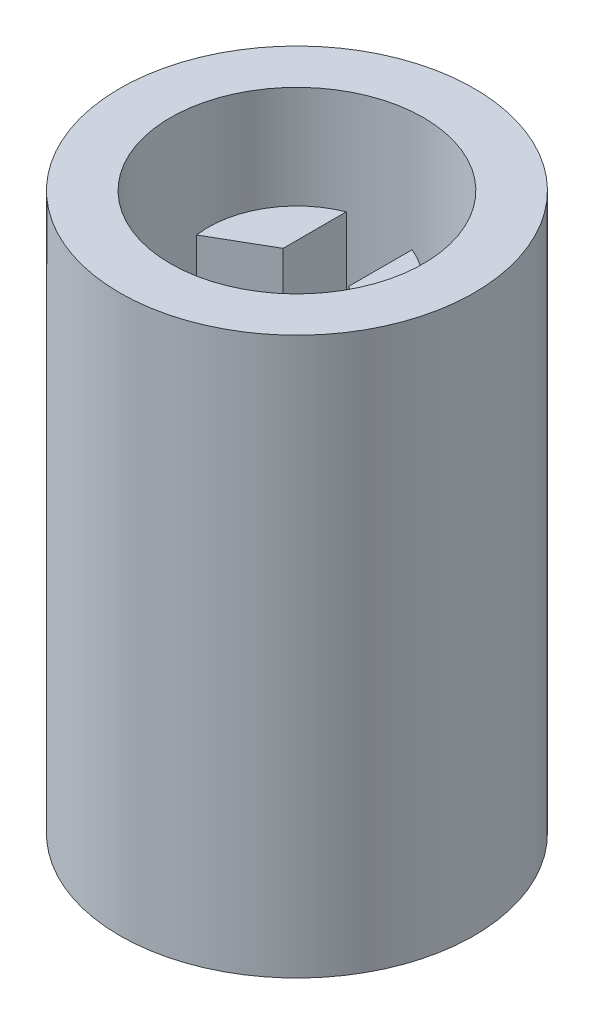
ISO-10303-21;
HEADER;
FILE_DESCRIPTION(('STEP AP214'),'2;1');
FILE_NAME('part.step','',(''),(''),'','','');
FILE_SCHEMA(('AUTOMOTIVE_DESIGN { 1 0 10303 214 1 1 1 1 }'));
ENDSEC;
DATA;
#1=APPLICATION_CONTEXT('core data for automotive mechanical design processes');
#2=APPLICATION_PROTOCOL_DEFINITION('international standard','automotive_design',2000,#1);
#3=PRODUCT_CONTEXT('',#1,'mechanical');
#4=PRODUCT('Part','Part','',(#3));
#5=PRODUCT_RELATED_PRODUCT_CATEGORY('part','',(#4));
#6=PRODUCT_DEFINITION_FORMATION('','',#4);
#7=PRODUCT_DEFINITION_CONTEXT('part definition',#1,'design');
#8=PRODUCT_DEFINITION('design','',#6,#7);
#9=PRODUCT_DEFINITION_SHAPE('','',#8);
#10=(LENGTH_UNIT() NAMED_UNIT(*) SI_UNIT(.MILLI.,.METRE.));
#11=(NAMED_UNIT(*) PLANE_ANGLE_UNIT() SI_UNIT($,.RADIAN.));
#12=(NAMED_UNIT(*) SI_UNIT($,.STERADIAN.) SOLID_ANGLE_UNIT());
#13=UNCERTAINTY_MEASURE_WITH_UNIT(LENGTH_MEASURE(1.E-05),#10,'distance_accuracy_value','');
#14=(GEOMETRIC_REPRESENTATION_CONTEXT(3) GLOBAL_UNCERTAINTY_ASSIGNED_CONTEXT((#13)) GLOBAL_UNIT_ASSIGNED_CONTEXT((#10,
#11,#12)) REPRESENTATION_CONTEXT('',''));
#15=CARTESIAN_POINT('',(0.,0.,0.));
#16=DIRECTION('',(0.,0.,1.));
#17=DIRECTION('',(1.,0.,0.));
#18=AXIS2_PLACEMENT_3D('',#15,#16,#17);
#19=CARTESIAN_POINT('',(0.,22.,0.));
#20=DIRECTION('',(0.,-1.,0.));
#21=DIRECTION('',(0.,0.,-1.));
#22=AXIS2_PLACEMENT_3D('',#19,#20,#21);
#23=CYLINDRICAL_SURFACE('',#22,7.);
#24=CARTESIAN_POINT('',(0.,22.,0.));
#25=DIRECTION('',(0.,1.,0.));
#26=DIRECTION('',(0.,0.,1.));
#27=AXIS2_PLACEMENT_3D('',#24,#25,#26);
#28=CIRCLE('',#27,7.);
#29=CARTESIAN_POINT('',(0.,22.,7.));
#30=VERTEX_POINT('',#29);
#31=EDGE_CURVE('E11',#30,#30,#28,.T.);
#32=ORIENTED_EDGE('',*,*,#31,.F.);
#33=EDGE_LOOP('',(#32));
#34=FACE_BOUND('',#33,.T.);
#35=CARTESIAN_POINT('',(0.,0.,0.));
#36=DIRECTION('',(0.,1.,0.));
#37=DIRECTION('',(0.,0.,1.));
#38=AXIS2_PLACEMENT_3D('',#35,#36,#37);
#39=CIRCLE('',#38,7.);
#40=CARTESIAN_POINT('',(0.,0.,7.));
#41=VERTEX_POINT('',#40);
#42=EDGE_CURVE('E49',#41,#41,#39,.T.);
#43=ORIENTED_EDGE('',*,*,#42,.T.);
#44=EDGE_LOOP('',(#43));
#45=FACE_BOUND('',#44,.T.);
#46=ADVANCED_FACE('F46',(#34,#45),#23,.T.);
#47=CARTESIAN_POINT('',(0.,22.,0.));
#48=DIRECTION('',(0.,1.,0.));
#49=DIRECTION('',(0.,0.,1.));
#50=AXIS2_PLACEMENT_3D('',#47,#48,#49);
#51=PLANE('',#50);
#52=CARTESIAN_POINT('',(0.,22.,0.));
#53=DIRECTION('',(0.,1.,0.));
#54=DIRECTION('',(0.,0.,1.));
#55=AXIS2_PLACEMENT_3D('',#52,#53,#54);
#56=CIRCLE('',#55,5.);
#57=CARTESIAN_POINT('',(0.,22.,5.));
#58=VERTEX_POINT('',#57);
#59=EDGE_CURVE('E500',#58,#58,#56,.T.);
#60=ORIENTED_EDGE('',*,*,#59,.F.);
#61=EDGE_LOOP('',(#60));
#62=FACE_BOUND('',#61,.T.);
#63=ORIENTED_EDGE('',*,*,#31,.T.);
#64=EDGE_LOOP('',(#63));
#65=FACE_BOUND('',#64,.T.);
#66=ADVANCED_FACE('F244',(#62,#65),#51,.T.);
#67=CARTESIAN_POINT('',(0.,0.,0.));
#68=DIRECTION('',(0.,1.,0.));
#69=DIRECTION('',(0.,0.,1.));
#70=AXIS2_PLACEMENT_3D('',#67,#68,#69);
#71=PLANE('',#70);
#72=CARTESIAN_POINT('',(0.,0.,0.));
#73=DIRECTION('',(0.,1.,0.));
#74=DIRECTION('',(0.,0.,1.));
#75=AXIS2_PLACEMENT_3D('',#72,#73,#74);
#76=CIRCLE('',#75,0.5);
#77=CARTESIAN_POINT('',(0.,0.,0.5));
#78=VERTEX_POINT('',#77);
#79=EDGE_CURVE('E517',#78,#78,#76,.T.);
#80=ORIENTED_EDGE('',*,*,#79,.T.);
#81=EDGE_LOOP('',(#80));
#82=FACE_BOUND('',#81,.T.);
#83=ORIENTED_EDGE('',*,*,#42,.F.);
#84=EDGE_LOOP('',(#83));
#85=FACE_BOUND('',#84,.T.);
#86=ADVANCED_FACE('F241',(#82,#85),#71,.F.);
#87=CARTESIAN_POINT('',(0.,19.,0.));
#88=DIRECTION('',(0.,-1.,0.));
#89=DIRECTION('',(0.,0.,-1.));
#90=AXIS2_PLACEMENT_3D('',#87,#88,#89);
#91=CYLINDRICAL_SURFACE('',#90,5.);
#92=CARTESIAN_POINT('',(0.,2.,0.));
#93=DIRECTION('',(0.,-1.,0.));
#94=DIRECTION('',(0.,0.,-1.));
#95=AXIS2_PLACEMENT_3D('',#92,#93,#94);
#96=CIRCLE('',#95,5.);
#97=CARTESIAN_POINT('',(0.,2.,-5.));
#98=VERTEX_POINT('',#97);
#99=EDGE_CURVE('E175',#98,#98,#96,.T.);
#100=ORIENTED_EDGE('',*,*,#99,.T.);
#101=EDGE_LOOP('',(#100));
#102=FACE_BOUND('',#101,.T.);
#103=ORIENTED_EDGE('',*,*,#59,.T.);
#104=EDGE_LOOP('',(#103));
#105=FACE_BOUND('',#104,.T.);
#106=ADVANCED_FACE('F243',(#102,#105),#91,.F.);
#107=CARTESIAN_POINT('',(1.29903810567666,19.,-0.750000000000004));
#108=DIRECTION('',(1.,0.,0.));
#109=DIRECTION('',(0.,0.,-1.));
#110=AXIS2_PLACEMENT_3D('',#107,#108,#109);
#111=PLANE('',#110);
#112=DIRECTION('',(0.,0.,1.));
#113=VECTOR('',#112,1.);
#114=CARTESIAN_POINT('',(1.29903810567666,4.,-0.750000000000004));
#115=LINE('',#114,#113);
#116=CARTESIAN_POINT('',(1.29903810567664,4.,-3.25000000000001));
#117=VERTEX_POINT('',#116);
#118=CARTESIAN_POINT('',(1.29903810567666,4.,-0.750000000000004));
#119=VERTEX_POINT('',#118);
#120=EDGE_CURVE('E210',#117,#119,#115,.T.);
#121=ORIENTED_EDGE('',*,*,#120,.T.);
#122=DIRECTION('',(0.,-1.,0.));
#123=VECTOR('',#122,1.);
#124=CARTESIAN_POINT('',(1.29903810567666,19.,-0.750000000000004));
#125=LINE('',#124,#123);
#126=CARTESIAN_POINT('',(1.29903810567666,19.,-0.750000000000004));
#127=VERTEX_POINT('',#126);
#128=EDGE_CURVE('E233',#127,#119,#125,.T.);
#129=ORIENTED_EDGE('',*,*,#128,.F.);
#130=DIRECTION('',(0.,0.,1.));
#131=VECTOR('',#130,1.);
#132=CARTESIAN_POINT('',(1.29903810567666,19.,-0.750000000000004));
#133=LINE('',#132,#131);
#134=CARTESIAN_POINT('',(1.29903810567664,19.,-3.25000000000001));
#135=VERTEX_POINT('',#134);
#136=EDGE_CURVE('E62',#135,#127,#133,.T.);
#137=ORIENTED_EDGE('',*,*,#136,.F.);
#138=DIRECTION('',(0.,-1.,0.));
#139=VECTOR('',#138,1.);
#140=CARTESIAN_POINT('',(1.29903810567664,19.,-3.25000000000001));
#141=LINE('',#140,#139);
#142=EDGE_CURVE('E125',#135,#117,#141,.T.);
#143=ORIENTED_EDGE('',*,*,#142,.T.);
#144=EDGE_LOOP('',(#121,#129,#137,#143));
#145=FACE_BOUND('',#144,.T.);
#146=ADVANCED_FACE('F251',(#145),#111,.F.);
#147=CARTESIAN_POINT('',(1.29903810567666,19.,-0.750000000000004));
#148=DIRECTION('',(0.5,0.,-0.866025403784439));
#149=DIRECTION('',(-0.866025403784439,0.,-0.5));
#150=AXIS2_PLACEMENT_3D('',#147,#148,#149);
#151=PLANE('',#150);
#152=DIRECTION('',(0.866025403784439,0.,0.5));
#153=VECTOR('',#152,1.);
#154=CARTESIAN_POINT('',(1.29903810567666,4.,-0.750000000000004));
#155=LINE('',#154,#153);
#156=CARTESIAN_POINT('',(3.46410161513776,4.,0.499999999999997));
#157=VERTEX_POINT('',#156);
#158=EDGE_CURVE('E75',#119,#157,#155,.T.);
#159=ORIENTED_EDGE('',*,*,#158,.T.);
#160=DIRECTION('',(0.,-1.,0.));
#161=VECTOR('',#160,1.);
#162=CARTESIAN_POINT('',(3.46410161513776,19.,0.499999999999997));
#163=LINE('',#162,#161);
#164=CARTESIAN_POINT('',(3.46410161513776,19.,0.499999999999997));
#165=VERTEX_POINT('',#164);
#166=EDGE_CURVE('E230',#165,#157,#163,.T.);
#167=ORIENTED_EDGE('',*,*,#166,.F.);
#168=DIRECTION('',(0.866025403784439,0.,0.5));
#169=VECTOR('',#168,1.);
#170=CARTESIAN_POINT('',(1.29903810567666,19.,-0.750000000000004));
#171=LINE('',#170,#169);
#172=EDGE_CURVE('E213',#127,#165,#171,.T.);
#173=ORIENTED_EDGE('',*,*,#172,.F.);
#174=ORIENTED_EDGE('',*,*,#128,.T.);
#175=EDGE_LOOP('',(#159,#167,#173,#174));
#176=FACE_BOUND('',#175,.T.);
#177=ADVANCED_FACE('F281',(#176),#151,.F.);
#178=CARTESIAN_POINT('',(0.,19.,0.));
#179=DIRECTION('',(0.,-1.,0.));
#180=DIRECTION('',(0.,0.,-1.));
#181=AXIS2_PLACEMENT_3D('',#178,#179,#180);
#182=CYLINDRICAL_SURFACE('',#181,3.5);
#183=CARTESIAN_POINT('',(0.,4.,0.));
#184=DIRECTION('',(0.,1.,0.));
#185=DIRECTION('',(0.,0.,1.));
#186=AXIS2_PLACEMENT_3D('',#183,#184,#185);
#187=CIRCLE('',#186,3.5);
#188=EDGE_CURVE('E214',#157,#117,#187,.T.);
#189=ORIENTED_EDGE('',*,*,#188,.T.);
#190=ORIENTED_EDGE('',*,*,#142,.F.);
#191=CARTESIAN_POINT('',(0.,19.,0.));
#192=DIRECTION('',(0.,1.,0.));
#193=DIRECTION('',(0.,0.,1.));
#194=AXIS2_PLACEMENT_3D('',#191,#192,#193);
#195=CIRCLE('',#194,3.5);
#196=EDGE_CURVE('E218',#165,#135,#195,.T.);
#197=ORIENTED_EDGE('',*,*,#196,.F.);
#198=ORIENTED_EDGE('',*,*,#166,.T.);
#199=EDGE_LOOP('',(#189,#190,#197,#198));
#200=FACE_BOUND('',#199,.T.);
#201=ADVANCED_FACE('F289',(#200),#182,.T.);
#202=CARTESIAN_POINT('',(-1.29903810567666,19.,-0.749999999999997));
#203=DIRECTION('',(-0.500000000000005,0.,-0.866025403784436));
#204=DIRECTION('',(-0.866025403784436,0.,0.500000000000005));
#205=AXIS2_PLACEMENT_3D('',#202,#203,#204);
#206=PLANE('',#205);
#207=DIRECTION('',(0.866025403784436,0.,-0.500000000000005));
#208=VECTOR('',#207,1.);
#209=CARTESIAN_POINT('',(-1.29903810567666,4.,-0.749999999999997));
#210=LINE('',#209,#208);
#211=CARTESIAN_POINT('',(-3.46410161513775,4.,0.500000000000017));
#212=VERTEX_POINT('',#211);
#213=CARTESIAN_POINT('',(-1.29903810567666,4.,-0.749999999999997));
#214=VERTEX_POINT('',#213);
#215=EDGE_CURVE('E184',#212,#214,#210,.T.);
#216=ORIENTED_EDGE('',*,*,#215,.T.);
#217=DIRECTION('',(0.,-1.,0.));
#218=VECTOR('',#217,1.);
#219=CARTESIAN_POINT('',(-1.29903810567666,19.,-0.749999999999997));
#220=LINE('',#219,#218);
#221=CARTESIAN_POINT('',(-1.29903810567666,19.,-0.749999999999997));
#222=VERTEX_POINT('',#221);
#223=EDGE_CURVE('E207',#222,#214,#220,.T.);
#224=ORIENTED_EDGE('',*,*,#223,.F.);
#225=DIRECTION('',(0.866025403784436,0.,-0.500000000000005));
#226=VECTOR('',#225,1.);
#227=CARTESIAN_POINT('',(-1.29903810567666,19.,-0.749999999999997));
#228=LINE('',#227,#226);
#229=CARTESIAN_POINT('',(-3.46410161513775,19.,0.500000000000017));
#230=VERTEX_POINT('',#229);
#231=EDGE_CURVE('E83',#230,#222,#228,.T.);
#232=ORIENTED_EDGE('',*,*,#231,.F.);
#233=DIRECTION('',(0.,-1.,0.));
#234=VECTOR('',#233,1.);
#235=CARTESIAN_POINT('',(-3.46410161513775,19.,0.500000000000017));
#236=LINE('',#235,#234);
#237=EDGE_CURVE('E121',#230,#212,#236,.T.);
#238=ORIENTED_EDGE('',*,*,#237,.T.);
#239=EDGE_LOOP('',(#216,#224,#232,#238));
#240=FACE_BOUND('',#239,.T.);
#241=ADVANCED_FACE('F297',(#240),#206,.F.);
#242=CARTESIAN_POINT('',(-1.29903810567666,19.,-0.749999999999997));
#243=DIRECTION('',(-1.,0.,0.));
#244=DIRECTION('',(0.,0.,1.));
#245=AXIS2_PLACEMENT_3D('',#242,#243,#244);
#246=PLANE('',#245);
#247=DIRECTION('',(0.,0.,-1.));
#248=VECTOR('',#247,1.);
#249=CARTESIAN_POINT('',(-1.29903810567666,4.,-0.749999999999997));
#250=LINE('',#249,#248);
#251=CARTESIAN_POINT('',(-1.29903810567666,4.,-3.25));
#252=VERTEX_POINT('',#251);
#253=EDGE_CURVE('E96',#214,#252,#250,.T.);
#254=ORIENTED_EDGE('',*,*,#253,.T.);
#255=DIRECTION('',(0.,-1.,0.));
#256=VECTOR('',#255,1.);
#257=CARTESIAN_POINT('',(-1.29903810567666,19.,-3.25));
#258=LINE('',#257,#256);
#259=CARTESIAN_POINT('',(-1.29903810567666,19.,-3.25));
#260=VERTEX_POINT('',#259);
#261=EDGE_CURVE('E204',#260,#252,#258,.T.);
#262=ORIENTED_EDGE('',*,*,#261,.F.);
#263=DIRECTION('',(0.,0.,-1.));
#264=VECTOR('',#263,1.);
#265=CARTESIAN_POINT('',(-1.29903810567666,19.,-0.749999999999997));
#266=LINE('',#265,#264);
#267=EDGE_CURVE('E187',#222,#260,#266,.T.);
#268=ORIENTED_EDGE('',*,*,#267,.F.);
#269=ORIENTED_EDGE('',*,*,#223,.T.);
#270=EDGE_LOOP('',(#254,#262,#268,#269));
#271=FACE_BOUND('',#270,.T.);
#272=ADVANCED_FACE('F306',(#271),#246,.F.);
#273=CARTESIAN_POINT('',(0.,19.,0.));
#274=DIRECTION('',(0.,-1.,0.));
#275=DIRECTION('',(0.,0.,-1.));
#276=AXIS2_PLACEMENT_3D('',#273,#274,#275);
#277=CYLINDRICAL_SURFACE('',#276,3.5);
#278=CARTESIAN_POINT('',(0.,4.,0.));
#279=DIRECTION('',(0.,1.,0.));
#280=DIRECTION('',(0.,0.,1.));
#281=AXIS2_PLACEMENT_3D('',#278,#279,#280);
#282=CIRCLE('',#281,3.5);
#283=EDGE_CURVE('E188',#252,#212,#282,.T.);
#284=ORIENTED_EDGE('',*,*,#283,.T.);
#285=ORIENTED_EDGE('',*,*,#237,.F.);
#286=CARTESIAN_POINT('',(0.,19.,0.));
#287=DIRECTION('',(0.,1.,0.));
#288=DIRECTION('',(0.,0.,1.));
#289=AXIS2_PLACEMENT_3D('',#286,#287,#288);
#290=CIRCLE('',#289,3.5);
#291=EDGE_CURVE('E192',#260,#230,#290,.T.);
#292=ORIENTED_EDGE('',*,*,#291,.F.);
#293=ORIENTED_EDGE('',*,*,#261,.T.);
#294=EDGE_LOOP('',(#284,#285,#292,#293));
#295=FACE_BOUND('',#294,.T.);
#296=ADVANCED_FACE('F314',(#295),#277,.T.);
#297=CARTESIAN_POINT('',(0.,19.,1.5));
#298=DIRECTION('',(-0.499999999999995,0.,0.866025403784441));
#299=DIRECTION('',(0.866025403784441,0.,0.499999999999995));
#300=AXIS2_PLACEMENT_3D('',#297,#298,#299);
#301=PLANE('',#300);
#302=DIRECTION('',(-0.866025403784441,0.,-0.499999999999995));
#303=VECTOR('',#302,1.);
#304=CARTESIAN_POINT('',(0.,4.,1.5));
#305=LINE('',#304,#303);
#306=CARTESIAN_POINT('',(2.16506350946111,4.,2.74999999999999));
#307=VERTEX_POINT('',#306);
#308=CARTESIAN_POINT('',(0.,4.,1.5));
#309=VERTEX_POINT('',#308);
#310=EDGE_CURVE('E171',#307,#309,#305,.T.);
#311=ORIENTED_EDGE('',*,*,#310,.T.);
#312=DIRECTION('',(0.,-1.,0.));
#313=VECTOR('',#312,1.);
#314=CARTESIAN_POINT('',(0.,19.,1.5));
#315=LINE('',#314,#313);
#316=CARTESIAN_POINT('',(0.,19.,1.5));
#317=VERTEX_POINT('',#316);
#318=EDGE_CURVE('E161',#317,#309,#315,.T.);
#319=ORIENTED_EDGE('',*,*,#318,.F.);
#320=DIRECTION('',(-0.866025403784441,0.,-0.499999999999995));
#321=VECTOR('',#320,1.);
#322=CARTESIAN_POINT('',(0.,19.,1.5));
#323=LINE('',#322,#321);
#324=CARTESIAN_POINT('',(2.16506350946111,19.,2.74999999999999));
#325=VERTEX_POINT('',#324);
#326=EDGE_CURVE('E104',#325,#317,#323,.T.);
#327=ORIENTED_EDGE('',*,*,#326,.F.);
#328=DIRECTION('',(0.,-1.,0.));
#329=VECTOR('',#328,1.);
#330=CARTESIAN_POINT('',(2.16506350946111,19.,2.74999999999999));
#331=LINE('',#330,#329);
#332=EDGE_CURVE('E152',#325,#307,#331,.T.);
#333=ORIENTED_EDGE('',*,*,#332,.T.);
#334=EDGE_LOOP('',(#311,#319,#327,#333));
#335=FACE_BOUND('',#334,.T.);
#336=ADVANCED_FACE('F323',(#335),#301,.F.);
#337=CARTESIAN_POINT('',(0.,19.,1.5));
#338=DIRECTION('',(0.500000000000001,0.,0.866025403784438));
#339=DIRECTION('',(0.866025403784438,0.,-0.500000000000001));
#340=AXIS2_PLACEMENT_3D('',#337,#338,#339);
#341=PLANE('',#340);
#342=DIRECTION('',(-0.866025403784438,0.,0.500000000000001));
#343=VECTOR('',#342,1.);
#344=CARTESIAN_POINT('',(0.,4.,1.5));
#345=LINE('',#344,#343);
#346=CARTESIAN_POINT('',(-2.16506350946109,4.,2.75));
#347=VERTEX_POINT('',#346);
#348=EDGE_CURVE('E116',#309,#347,#345,.T.);
#349=ORIENTED_EDGE('',*,*,#348,.T.);
#350=DIRECTION('',(0.,-1.,0.));
#351=VECTOR('',#350,1.);
#352=CARTESIAN_POINT('',(-2.16506350946109,19.,2.75));
#353=LINE('',#352,#351);
#354=CARTESIAN_POINT('',(-2.16506350946109,19.,2.75));
#355=VERTEX_POINT('',#354);
#356=EDGE_CURVE('E151',#355,#347,#353,.T.);
#357=ORIENTED_EDGE('',*,*,#356,.F.);
#358=DIRECTION('',(-0.866025403784438,0.,0.500000000000001));
#359=VECTOR('',#358,1.);
#360=CARTESIAN_POINT('',(0.,19.,1.5));
#361=LINE('',#360,#359);
#362=EDGE_CURVE('E156',#317,#355,#361,.T.);
#363=ORIENTED_EDGE('',*,*,#362,.F.);
#364=ORIENTED_EDGE('',*,*,#318,.T.);
#365=EDGE_LOOP('',(#349,#357,#363,#364));
#366=FACE_BOUND('',#365,.T.);
#367=ADVANCED_FACE('F159',(#366),#341,.F.);
#368=CARTESIAN_POINT('',(0.,19.,0.));
#369=DIRECTION('',(0.,-1.,0.));
#370=DIRECTION('',(0.,0.,-1.));
#371=AXIS2_PLACEMENT_3D('',#368,#369,#370);
#372=CYLINDRICAL_SURFACE('',#371,3.5);
#373=CARTESIAN_POINT('',(0.,4.,0.));
#374=DIRECTION('',(0.,1.,0.));
#375=DIRECTION('',(0.,0.,1.));
#376=AXIS2_PLACEMENT_3D('',#373,#374,#375);
#377=CIRCLE('',#376,3.5);
#378=EDGE_CURVE('E167',#347,#307,#377,.T.);
#379=ORIENTED_EDGE('',*,*,#378,.T.);
#380=ORIENTED_EDGE('',*,*,#332,.F.);
#381=CARTESIAN_POINT('',(0.,19.,0.));
#382=DIRECTION('',(0.,1.,0.));
#383=DIRECTION('',(0.,0.,1.));
#384=AXIS2_PLACEMENT_3D('',#381,#382,#383);
#385=CIRCLE('',#384,3.5);
#386=EDGE_CURVE('E147',#355,#325,#385,.T.);
#387=ORIENTED_EDGE('',*,*,#386,.F.);
#388=ORIENTED_EDGE('',*,*,#356,.T.);
#389=EDGE_LOOP('',(#379,#380,#387,#388));
#390=FACE_BOUND('',#389,.T.);
#391=ADVANCED_FACE('F150',(#390),#372,.T.);
#392=CARTESIAN_POINT('',(0.,4.,0.));
#393=DIRECTION('',(0.,-1.,0.));
#394=DIRECTION('',(0.,0.,-1.));
#395=AXIS2_PLACEMENT_3D('',#392,#393,#394);
#396=PLANE('',#395);
#397=CARTESIAN_POINT('',(-2.16506350946109,4.,-1.25));
#398=DIRECTION('',(0.,-1.,0.));
#399=DIRECTION('',(0.,0.,-1.));
#400=AXIS2_PLACEMENT_3D('',#397,#398,#399);
#401=CIRCLE('',#400,0.75);
#402=CARTESIAN_POINT('',(-2.16506350946109,4.,-2.));
#403=VERTEX_POINT('',#402);
#404=EDGE_CURVE('E493',#403,#403,#401,.T.);
#405=ORIENTED_EDGE('',*,*,#404,.F.);
#406=EDGE_LOOP('',(#405));
#407=FACE_BOUND('',#406,.T.);
#408=ORIENTED_EDGE('',*,*,#283,.F.);
#409=ORIENTED_EDGE('',*,*,#253,.F.);
#410=ORIENTED_EDGE('',*,*,#215,.F.);
#411=EDGE_LOOP('',(#408,#409,#410));
#412=FACE_BOUND('',#411,.T.);
#413=ADVANCED_FACE('F346',(#407,#412),#396,.T.);
#414=CARTESIAN_POINT('',(2.1650635094611,4.,-1.25));
#415=DIRECTION('',(0.,-1.,0.));
#416=DIRECTION('',(0.,0.,-1.));
#417=AXIS2_PLACEMENT_3D('',#414,#415,#416);
#418=CIRCLE('',#417,0.75);
#419=CARTESIAN_POINT('',(2.1650635094611,4.,-2.));
#420=VERTEX_POINT('',#419);
#421=EDGE_CURVE('E492',#420,#420,#418,.T.);
#422=ORIENTED_EDGE('',*,*,#421,.F.);
#423=EDGE_LOOP('',(#422));
#424=FACE_BOUND('',#423,.T.);
#425=ORIENTED_EDGE('',*,*,#188,.F.);
#426=ORIENTED_EDGE('',*,*,#158,.F.);
#427=ORIENTED_EDGE('',*,*,#120,.F.);
#428=EDGE_LOOP('',(#425,#426,#427));
#429=FACE_BOUND('',#428,.T.);
#430=ADVANCED_FACE('F354',(#424,#429),#396,.T.);
#431=CARTESIAN_POINT('',(0.,4.,2.5));
#432=DIRECTION('',(0.,-1.,0.));
#433=DIRECTION('',(0.,0.,-1.));
#434=AXIS2_PLACEMENT_3D('',#431,#432,#433);
#435=CIRCLE('',#434,0.750000000000004);
#436=CARTESIAN_POINT('',(0.,4.,1.75));
#437=VERTEX_POINT('',#436);
#438=EDGE_CURVE('E506',#437,#437,#435,.T.);
#439=ORIENTED_EDGE('',*,*,#438,.F.);
#440=EDGE_LOOP('',(#439));
#441=FACE_BOUND('',#440,.T.);
#442=ORIENTED_EDGE('',*,*,#378,.F.);
#443=ORIENTED_EDGE('',*,*,#348,.F.);
#444=ORIENTED_EDGE('',*,*,#310,.F.);
#445=EDGE_LOOP('',(#442,#443,#444));
#446=FACE_BOUND('',#445,.T.);
#447=ADVANCED_FACE('F357',(#441,#446),#396,.T.);
#448=CARTESIAN_POINT('',(0.,2.,0.));
#449=DIRECTION('',(0.,-1.,0.));
#450=DIRECTION('',(0.,0.,-1.));
#451=AXIS2_PLACEMENT_3D('',#448,#449,#450);
#452=PLANE('',#451);
#453=CARTESIAN_POINT('',(0.,2.,0.));
#454=DIRECTION('',(0.,1.,0.));
#455=DIRECTION('',(0.,0.,1.));
#456=AXIS2_PLACEMENT_3D('',#453,#454,#455);
#457=CIRCLE('',#456,0.5);
#458=CARTESIAN_POINT('',(0.,2.,0.5));
#459=VERTEX_POINT('',#458);
#460=EDGE_CURVE('E476',#459,#459,#457,.T.);
#461=ORIENTED_EDGE('',*,*,#460,.F.);
#462=EDGE_LOOP('',(#461));
#463=FACE_BOUND('',#462,.T.);
#464=CARTESIAN_POINT('',(2.1650635094611,2.,-1.25));
#465=DIRECTION('',(0.,-1.,0.));
#466=DIRECTION('',(0.,0.,-1.));
#467=AXIS2_PLACEMENT_3D('',#464,#465,#466);
#468=CIRCLE('',#467,0.75);
#469=CARTESIAN_POINT('',(2.1650635094611,2.,-2.));
#470=VERTEX_POINT('',#469);
#471=EDGE_CURVE('E480',#470,#470,#468,.T.);
#472=ORIENTED_EDGE('',*,*,#471,.T.);
#473=EDGE_LOOP('',(#472));
#474=FACE_BOUND('',#473,.T.);
#475=ORIENTED_EDGE('',*,*,#99,.F.);
#476=EDGE_LOOP('',(#475));
#477=FACE_BOUND('',#476,.T.);
#478=CARTESIAN_POINT('',(0.,2.,2.5));
#479=DIRECTION('',(0.,-1.,0.));
#480=DIRECTION('',(0.,0.,-1.));
#481=AXIS2_PLACEMENT_3D('',#478,#479,#480);
#482=CIRCLE('',#481,0.750000000000004);
#483=CARTESIAN_POINT('',(0.,2.,1.75));
#484=VERTEX_POINT('',#483);
#485=EDGE_CURVE('E487',#484,#484,#482,.T.);
#486=ORIENTED_EDGE('',*,*,#485,.T.);
#487=EDGE_LOOP('',(#486));
#488=FACE_BOUND('',#487,.T.);
#489=CARTESIAN_POINT('',(-2.16506350946109,2.,-1.25));
#490=DIRECTION('',(0.,-1.,0.));
#491=DIRECTION('',(0.,0.,-1.));
#492=AXIS2_PLACEMENT_3D('',#489,#490,#491);
#493=CIRCLE('',#492,0.75);
#494=CARTESIAN_POINT('',(-2.16506350946109,2.,-2.));
#495=VERTEX_POINT('',#494);
#496=EDGE_CURVE('E490',#495,#495,#493,.T.);
#497=ORIENTED_EDGE('',*,*,#496,.T.);
#498=EDGE_LOOP('',(#497));
#499=FACE_BOUND('',#498,.T.);
#500=ADVANCED_FACE('F371',(#463,#474,#477,#488,#499),#452,.F.);
#501=CARTESIAN_POINT('',(0.,2.,2.5));
#502=DIRECTION('',(0.,1.,0.));
#503=DIRECTION('',(0.,0.,1.));
#504=AXIS2_PLACEMENT_3D('',#501,#502,#503);
#505=CYLINDRICAL_SURFACE('',#504,0.750000000000004);
#506=ORIENTED_EDGE('',*,*,#485,.F.);
#507=EDGE_LOOP('',(#506));
#508=FACE_BOUND('',#507,.T.);
#509=ORIENTED_EDGE('',*,*,#438,.T.);
#510=EDGE_LOOP('',(#509));
#511=FACE_BOUND('',#510,.T.);
#512=ADVANCED_FACE('F377',(#508,#511),#505,.T.);
#513=CARTESIAN_POINT('',(2.1650635094611,2.,-1.25));
#514=DIRECTION('',(0.,1.,0.));
#515=DIRECTION('',(0.,0.,1.));
#516=AXIS2_PLACEMENT_3D('',#513,#514,#515);
#517=CYLINDRICAL_SURFACE('',#516,0.75);
#518=ORIENTED_EDGE('',*,*,#471,.F.);
#519=EDGE_LOOP('',(#518));
#520=FACE_BOUND('',#519,.T.);
#521=ORIENTED_EDGE('',*,*,#421,.T.);
#522=EDGE_LOOP('',(#521));
#523=FACE_BOUND('',#522,.T.);
#524=ADVANCED_FACE('F381',(#520,#523),#517,.T.);
#525=CARTESIAN_POINT('',(-2.16506350946109,2.,-1.25));
#526=DIRECTION('',(0.,1.,0.));
#527=DIRECTION('',(0.,0.,1.));
#528=AXIS2_PLACEMENT_3D('',#525,#526,#527);
#529=CYLINDRICAL_SURFACE('',#528,0.75);
#530=ORIENTED_EDGE('',*,*,#496,.F.);
#531=EDGE_LOOP('',(#530));
#532=FACE_BOUND('',#531,.T.);
#533=ORIENTED_EDGE('',*,*,#404,.T.);
#534=EDGE_LOOP('',(#533));
#535=FACE_BOUND('',#534,.T.);
#536=ADVANCED_FACE('F390',(#532,#535),#529,.T.);
#537=CARTESIAN_POINT('',(0.,19.,0.));
#538=DIRECTION('',(0.,1.,0.));
#539=DIRECTION('',(0.,0.,1.));
#540=AXIS2_PLACEMENT_3D('',#537,#538,#539);
#541=PLANE('',#540);
#542=ORIENTED_EDGE('',*,*,#362,.T.);
#543=ORIENTED_EDGE('',*,*,#386,.T.);
#544=ORIENTED_EDGE('',*,*,#326,.T.);
#545=EDGE_LOOP('',(#542,#543,#544));
#546=FACE_BOUND('',#545,.T.);
#547=ADVANCED_FACE('F163',(#546),#541,.T.);
#548=ORIENTED_EDGE('',*,*,#267,.T.);
#549=ORIENTED_EDGE('',*,*,#291,.T.);
#550=ORIENTED_EDGE('',*,*,#231,.T.);
#551=EDGE_LOOP('',(#548,#549,#550));
#552=FACE_BOUND('',#551,.T.);
#553=ADVANCED_FACE('F407',(#552),#541,.T.);
#554=ORIENTED_EDGE('',*,*,#172,.T.);
#555=ORIENTED_EDGE('',*,*,#196,.T.);
#556=ORIENTED_EDGE('',*,*,#136,.T.);
#557=EDGE_LOOP('',(#554,#555,#556));
#558=FACE_BOUND('',#557,.T.);
#559=ADVANCED_FACE('F409',(#558),#541,.T.);
#560=CARTESIAN_POINT('',(0.,0.,0.));
#561=DIRECTION('',(0.,1.,0.));
#562=DIRECTION('',(0.,0.,1.));
#563=AXIS2_PLACEMENT_3D('',#560,#561,#562);
#564=CYLINDRICAL_SURFACE('',#563,0.5);
#565=ORIENTED_EDGE('',*,*,#79,.F.);
#566=EDGE_LOOP('',(#565));
#567=FACE_BOUND('',#566,.T.);
#568=ORIENTED_EDGE('',*,*,#460,.T.);
#569=EDGE_LOOP('',(#568));
#570=FACE_BOUND('',#569,.T.);
#571=ADVANCED_FACE('F421',(#567,#570),#564,.F.);
#572=CLOSED_SHELL('',(#46,#66,#86,#106,#146,#177,#201,#241,#272,#296,#336,#367,#391,#413,#430,
#447,#500,#512,#524,#536,#547,#553,#559,#571));
#573=MANIFOLD_SOLID_BREP('B2',#572);
#574=ADVANCED_BREP_SHAPE_REPRESENTATION('',(#18,#573),#14);
#575=SHAPE_DEFINITION_REPRESENTATION(#9,#574);
ENDSEC;
END-ISO-10303-21;
